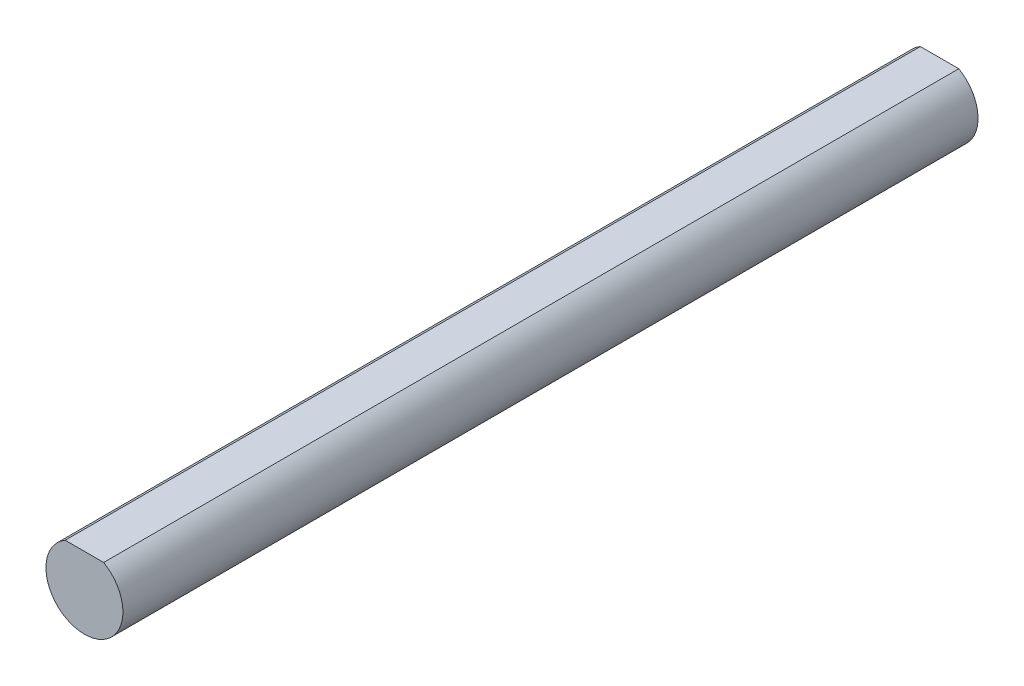
ISO-10303-21;
HEADER;
FILE_DESCRIPTION(('STEP AP214'),'2;1');
FILE_NAME('part.step','',(''),(''),'','','');
FILE_SCHEMA(('AUTOMOTIVE_DESIGN { 1 0 10303 214 1 1 1 1 }'));
ENDSEC;
DATA;
#1=APPLICATION_CONTEXT('core data for automotive mechanical design processes');
#2=APPLICATION_PROTOCOL_DEFINITION('international standard','automotive_design',2000,#1);
#3=PRODUCT_CONTEXT('',#1,'mechanical');
#4=PRODUCT('Part','Part','',(#3));
#5=PRODUCT_RELATED_PRODUCT_CATEGORY('part','',(#4));
#6=PRODUCT_DEFINITION_FORMATION('','',#4);
#7=PRODUCT_DEFINITION_CONTEXT('part definition',#1,'design');
#8=PRODUCT_DEFINITION('design','',#6,#7);
#9=PRODUCT_DEFINITION_SHAPE('','',#8);
#10=(LENGTH_UNIT() NAMED_UNIT(*) SI_UNIT(.MILLI.,.METRE.));
#11=(NAMED_UNIT(*) PLANE_ANGLE_UNIT() SI_UNIT($,.RADIAN.));
#12=(NAMED_UNIT(*) SI_UNIT($,.STERADIAN.) SOLID_ANGLE_UNIT());
#13=UNCERTAINTY_MEASURE_WITH_UNIT(LENGTH_MEASURE(1.E-05),#10,'distance_accuracy_value','');
#14=(GEOMETRIC_REPRESENTATION_CONTEXT(3) GLOBAL_UNCERTAINTY_ASSIGNED_CONTEXT((#13)) GLOBAL_UNIT_ASSIGNED_CONTEXT((#10,
#11,#12)) REPRESENTATION_CONTEXT('',''));
#15=CARTESIAN_POINT('',(0.,0.,0.));
#16=DIRECTION('',(0.,0.,1.));
#17=DIRECTION('',(1.,0.,0.));
#18=AXIS2_PLACEMENT_3D('',#15,#16,#17);
#19=CARTESIAN_POINT('',(0.,0.,76.2));
#20=DIRECTION('',(0.,0.,-1.));
#21=DIRECTION('',(-1.,0.,0.));
#22=AXIS2_PLACEMENT_3D('',#19,#20,#21);
#23=CYLINDRICAL_SURFACE('',#22,2.);
#24=CARTESIAN_POINT('',(0.,0.,57.15));
#25=DIRECTION('',(0.,0.,1.));
#26=DIRECTION('',(1.,0.,0.));
#27=AXIS2_PLACEMENT_3D('',#24,#25,#26);
#28=CIRCLE('',#27,2.);
#29=CARTESIAN_POINT('',(-1.,1.73205080756888,57.15));
#30=VERTEX_POINT('',#29);
#31=CARTESIAN_POINT('',(1.,1.73205080756888,57.15));
#32=VERTEX_POINT('',#31);
#33=EDGE_CURVE('E58',#30,#32,#28,.T.);
#34=ORIENTED_EDGE('',*,*,#33,.F.);
#35=DIRECTION('',(0.,0.,-1.));
#36=VECTOR('',#35,1.);
#37=CARTESIAN_POINT('',(-1.,1.73205080756888,76.2));
#38=LINE('',#37,#36);
#39=CARTESIAN_POINT('',(-1.,1.73205080756888,12.7));
#40=VERTEX_POINT('',#39);
#41=EDGE_CURVE('E64',#30,#40,#38,.T.);
#42=ORIENTED_EDGE('',*,*,#41,.T.);
#43=CARTESIAN_POINT('',(0.,0.,12.7));
#44=DIRECTION('',(0.,0.,-1.));
#45=DIRECTION('',(-1.,0.,0.));
#46=AXIS2_PLACEMENT_3D('',#43,#44,#45);
#47=CIRCLE('',#46,2.);
#48=CARTESIAN_POINT('',(1.,1.73205080756888,12.7));
#49=VERTEX_POINT('',#48);
#50=EDGE_CURVE('E75',#49,#40,#47,.T.);
#51=ORIENTED_EDGE('',*,*,#50,.F.);
#52=DIRECTION('',(0.,0.,-1.));
#53=VECTOR('',#52,1.);
#54=CARTESIAN_POINT('',(1.,1.73205080756888,76.2));
#55=LINE('',#54,#53);
#56=EDGE_CURVE('E73',#32,#49,#55,.T.);
#57=ORIENTED_EDGE('',*,*,#56,.F.);
#58=EDGE_LOOP('',(#34,#42,#51,#57));
#59=FACE_BOUND('',#58,.T.);
#60=ADVANCED_FACE('F44',(#59),#23,.T.);
#61=CARTESIAN_POINT('',(-1.,1.73205080756888,76.2));
#62=DIRECTION('',(0.,1.,0.));
#63=DIRECTION('',(0.,0.,1.));
#64=AXIS2_PLACEMENT_3D('',#61,#62,#63);
#65=PLANE('',#64);
#66=ORIENTED_EDGE('',*,*,#41,.F.);
#67=DIRECTION('',(1.,0.,0.));
#68=VECTOR('',#67,1.);
#69=CARTESIAN_POINT('',(-1.,1.73205080756888,57.15));
#70=LINE('',#69,#68);
#71=EDGE_CURVE('E11',#30,#32,#70,.T.);
#72=ORIENTED_EDGE('',*,*,#71,.T.);
#73=ORIENTED_EDGE('',*,*,#56,.T.);
#74=DIRECTION('',(-1.,0.,0.));
#75=VECTOR('',#74,1.);
#76=CARTESIAN_POINT('',(-1.,1.73205080756888,12.7));
#77=LINE('',#76,#75);
#78=EDGE_CURVE('E52',#49,#40,#77,.T.);
#79=ORIENTED_EDGE('',*,*,#78,.T.);
#80=EDGE_LOOP('',(#66,#72,#73,#79));
#81=FACE_BOUND('',#80,.T.);
#82=ADVANCED_FACE('F78',(#81),#65,.T.);
#83=CARTESIAN_POINT('',(0.,0.,12.7));
#84=DIRECTION('',(0.,0.,-1.));
#85=DIRECTION('',(-1.,0.,0.));
#86=AXIS2_PLACEMENT_3D('',#83,#84,#85);
#87=PLANE('',#86);
#88=ORIENTED_EDGE('',*,*,#50,.T.);
#89=ORIENTED_EDGE('',*,*,#78,.F.);
#90=EDGE_LOOP('',(#88,#89));
#91=FACE_BOUND('',#90,.T.);
#92=ADVANCED_FACE('F88',(#91),#87,.T.);
#93=CARTESIAN_POINT('',(0.,0.,57.15));
#94=DIRECTION('',(0.,0.,1.));
#95=DIRECTION('',(1.,0.,0.));
#96=AXIS2_PLACEMENT_3D('',#93,#94,#95);
#97=PLANE('',#96);
#98=ORIENTED_EDGE('',*,*,#33,.T.);
#99=ORIENTED_EDGE('',*,*,#71,.F.);
#100=EDGE_LOOP('',(#98,#99));
#101=FACE_BOUND('',#100,.T.);
#102=ADVANCED_FACE('F70',(#101),#97,.T.);
#103=CLOSED_SHELL('',(#60,#82,#92,#102));
#104=MANIFOLD_SOLID_BREP('B2',#103);
#105=ADVANCED_BREP_SHAPE_REPRESENTATION('',(#18,#104),#14);
#106=SHAPE_DEFINITION_REPRESENTATION(#9,#105);
ENDSEC;
END-ISO-10303-21;
